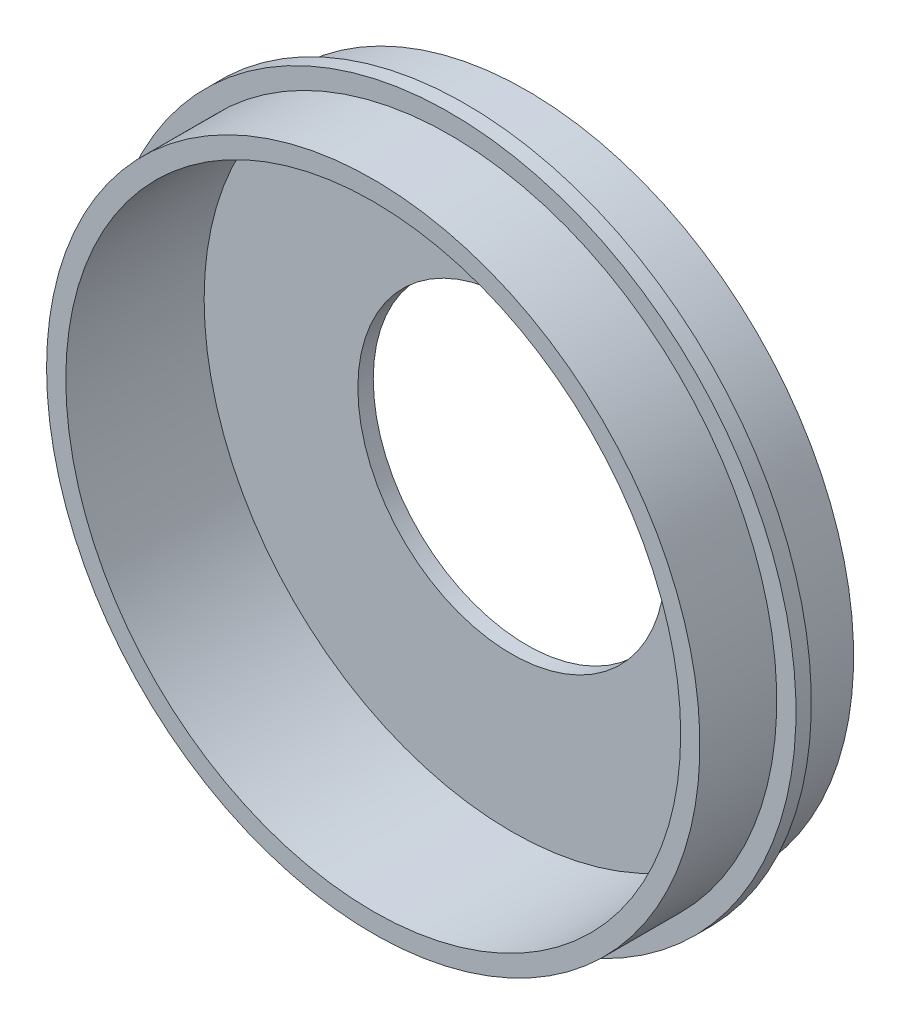
ISO-10303-21;
HEADER;
FILE_DESCRIPTION(('STEP AP214'),'2;1');
FILE_NAME('part.step','',(''),(''),'','','');
FILE_SCHEMA(('AUTOMOTIVE_DESIGN { 1 0 10303 214 1 1 1 1 }'));
ENDSEC;
DATA;
#1=APPLICATION_CONTEXT('core data for automotive mechanical design processes');
#2=APPLICATION_PROTOCOL_DEFINITION('international standard','automotive_design',2000,#1);
#3=PRODUCT_CONTEXT('',#1,'mechanical');
#4=PRODUCT('Part','Part','',(#3));
#5=PRODUCT_RELATED_PRODUCT_CATEGORY('part','',(#4));
#6=PRODUCT_DEFINITION_FORMATION('','',#4);
#7=PRODUCT_DEFINITION_CONTEXT('part definition',#1,'design');
#8=PRODUCT_DEFINITION('design','',#6,#7);
#9=PRODUCT_DEFINITION_SHAPE('','',#8);
#10=(LENGTH_UNIT() NAMED_UNIT(*) SI_UNIT(.MILLI.,.METRE.));
#11=(NAMED_UNIT(*) PLANE_ANGLE_UNIT() SI_UNIT($,.RADIAN.));
#12=(NAMED_UNIT(*) SI_UNIT($,.STERADIAN.) SOLID_ANGLE_UNIT());
#13=UNCERTAINTY_MEASURE_WITH_UNIT(LENGTH_MEASURE(1.E-05),#10,'distance_accuracy_value','');
#14=(GEOMETRIC_REPRESENTATION_CONTEXT(3) GLOBAL_UNCERTAINTY_ASSIGNED_CONTEXT((#13)) GLOBAL_UNIT_ASSIGNED_CONTEXT((#10,
#11,#12)) REPRESENTATION_CONTEXT('',''));
#15=CARTESIAN_POINT('',(0.,0.,0.));
#16=DIRECTION('',(0.,0.,1.));
#17=DIRECTION('',(1.,0.,0.));
#18=AXIS2_PLACEMENT_3D('',#15,#16,#17);
#19=CARTESIAN_POINT('',(0.,0.,0.));
#20=DIRECTION('',(0.,0.,-1.));
#21=DIRECTION('',(-1.,0.,0.));
#22=AXIS2_PLACEMENT_3D('',#19,#20,#21);
#23=CYLINDRICAL_SURFACE('',#22,53.975);
#24=CARTESIAN_POINT('',(0.,0.,25.4));
#25=DIRECTION('',(0.,0.,-1.));
#26=DIRECTION('',(-1.,0.,0.));
#27=AXIS2_PLACEMENT_3D('',#24,#25,#26);
#28=CIRCLE('',#27,53.975);
#29=CARTESIAN_POINT('',(-53.975,0.,25.4));
#30=VERTEX_POINT('',#29);
#31=EDGE_CURVE('E10',#30,#30,#28,.T.);
#32=ORIENTED_EDGE('',*,*,#31,.T.);
#33=EDGE_LOOP('',(#32));
#34=FACE_BOUND('',#33,.T.);
#35=CARTESIAN_POINT('',(0.,0.,12.7));
#36=DIRECTION('',(0.,0.,-1.));
#37=DIRECTION('',(-1.,0.,0.));
#38=AXIS2_PLACEMENT_3D('',#35,#36,#37);
#39=CIRCLE('',#38,53.975);
#40=CARTESIAN_POINT('',(-53.975,0.,12.7));
#41=VERTEX_POINT('',#40);
#42=EDGE_CURVE('E84',#41,#41,#39,.T.);
#43=ORIENTED_EDGE('',*,*,#42,.F.);
#44=EDGE_LOOP('',(#43));
#45=FACE_BOUND('',#44,.T.);
#46=ADVANCED_FACE('F41',(#34,#45),#23,.T.);
#47=CARTESIAN_POINT('',(0.,50.8,25.4));
#48=DIRECTION('',(0.,0.,1.));
#49=DIRECTION('',(1.,0.,0.));
#50=AXIS2_PLACEMENT_3D('',#47,#48,#49);
#51=PLANE('',#50);
#52=CARTESIAN_POINT('',(0.,0.,25.4));
#53=DIRECTION('',(0.,0.,-1.));
#54=DIRECTION('',(-1.,0.,0.));
#55=AXIS2_PLACEMENT_3D('',#52,#53,#54);
#56=CIRCLE('',#55,50.8);
#57=CARTESIAN_POINT('',(-50.8,0.,25.4));
#58=VERTEX_POINT('',#57);
#59=EDGE_CURVE('E48',#58,#58,#56,.T.);
#60=ORIENTED_EDGE('',*,*,#59,.T.);
#61=EDGE_LOOP('',(#60));
#62=FACE_BOUND('',#61,.T.);
#63=ORIENTED_EDGE('',*,*,#31,.F.);
#64=EDGE_LOOP('',(#63));
#65=FACE_BOUND('',#64,.T.);
#66=ADVANCED_FACE('F93',(#62,#65),#51,.T.);
#67=CARTESIAN_POINT('',(0.,0.,0.));
#68=DIRECTION('',(0.,0.,-1.));
#69=DIRECTION('',(-1.,0.,0.));
#70=AXIS2_PLACEMENT_3D('',#67,#68,#69);
#71=CYLINDRICAL_SURFACE('',#70,50.8);
#72=CARTESIAN_POINT('',(0.,0.,2.54));
#73=DIRECTION('',(0.,0.,-1.));
#74=DIRECTION('',(-1.,0.,0.));
#75=AXIS2_PLACEMENT_3D('',#72,#73,#74);
#76=CIRCLE('',#75,50.8);
#77=CARTESIAN_POINT('',(-50.8,0.,2.54));
#78=VERTEX_POINT('',#77);
#79=EDGE_CURVE('E53',#78,#78,#76,.T.);
#80=ORIENTED_EDGE('',*,*,#79,.T.);
#81=EDGE_LOOP('',(#80));
#82=FACE_BOUND('',#81,.T.);
#83=ORIENTED_EDGE('',*,*,#59,.F.);
#84=EDGE_LOOP('',(#83));
#85=FACE_BOUND('',#84,.T.);
#86=ADVANCED_FACE('F97',(#82,#85),#71,.F.);
#87=CARTESIAN_POINT('',(0.,25.4,2.54));
#88=DIRECTION('',(0.,0.,1.));
#89=DIRECTION('',(1.,0.,0.));
#90=AXIS2_PLACEMENT_3D('',#87,#88,#89);
#91=PLANE('',#90);
#92=CARTESIAN_POINT('',(0.,0.,2.54));
#93=DIRECTION('',(0.,0.,-1.));
#94=DIRECTION('',(-1.,0.,0.));
#95=AXIS2_PLACEMENT_3D('',#92,#93,#94);
#96=CIRCLE('',#95,25.4);
#97=CARTESIAN_POINT('',(-25.4,0.,2.54));
#98=VERTEX_POINT('',#97);
#99=EDGE_CURVE('E58',#98,#98,#96,.T.);
#100=ORIENTED_EDGE('',*,*,#99,.T.);
#101=EDGE_LOOP('',(#100));
#102=FACE_BOUND('',#101,.T.);
#103=ORIENTED_EDGE('',*,*,#79,.F.);
#104=EDGE_LOOP('',(#103));
#105=FACE_BOUND('',#104,.T.);
#106=ADVANCED_FACE('F101',(#102,#105),#91,.T.);
#107=CARTESIAN_POINT('',(0.,0.,0.));
#108=DIRECTION('',(0.,0.,-1.));
#109=DIRECTION('',(-1.,0.,0.));
#110=AXIS2_PLACEMENT_3D('',#107,#108,#109);
#111=CYLINDRICAL_SURFACE('',#110,25.4);
#112=CARTESIAN_POINT('',(0.,0.,0.));
#113=DIRECTION('',(0.,0.,-1.));
#114=DIRECTION('',(-1.,0.,0.));
#115=AXIS2_PLACEMENT_3D('',#112,#113,#114);
#116=CIRCLE('',#115,25.4);
#117=CARTESIAN_POINT('',(-25.4,0.,0.));
#118=VERTEX_POINT('',#117);
#119=EDGE_CURVE('E64',#118,#118,#116,.T.);
#120=ORIENTED_EDGE('',*,*,#119,.T.);
#121=EDGE_LOOP('',(#120));
#122=FACE_BOUND('',#121,.T.);
#123=ORIENTED_EDGE('',*,*,#99,.F.);
#124=EDGE_LOOP('',(#123));
#125=FACE_BOUND('',#124,.T.);
#126=ADVANCED_FACE('F108',(#122,#125),#111,.F.);
#127=CARTESIAN_POINT('',(0.,53.975,0.));
#128=DIRECTION('',(0.,0.,-1.));
#129=DIRECTION('',(-1.,0.,0.));
#130=AXIS2_PLACEMENT_3D('',#127,#128,#129);
#131=PLANE('',#130);
#132=CARTESIAN_POINT('',(0.,0.,0.));
#133=DIRECTION('',(0.,0.,-1.));
#134=DIRECTION('',(-1.,0.,0.));
#135=AXIS2_PLACEMENT_3D('',#132,#133,#134);
#136=CIRCLE('',#135,53.975);
#137=CARTESIAN_POINT('',(-53.975,0.,0.));
#138=VERTEX_POINT('',#137);
#139=EDGE_CURVE('E68',#138,#138,#136,.T.);
#140=ORIENTED_EDGE('',*,*,#139,.T.);
#141=EDGE_LOOP('',(#140));
#142=FACE_BOUND('',#141,.T.);
#143=ORIENTED_EDGE('',*,*,#119,.F.);
#144=EDGE_LOOP('',(#143));
#145=FACE_BOUND('',#144,.T.);
#146=ADVANCED_FACE('F112',(#142,#145),#131,.T.);
#147=CARTESIAN_POINT('',(0.,0.,0.));
#148=DIRECTION('',(0.,0.,-1.));
#149=DIRECTION('',(-1.,0.,0.));
#150=AXIS2_PLACEMENT_3D('',#147,#148,#149);
#151=CYLINDRICAL_SURFACE('',#150,53.975);
#152=CARTESIAN_POINT('',(0.,0.,10.16));
#153=DIRECTION('',(0.,0.,-1.));
#154=DIRECTION('',(-1.,0.,0.));
#155=AXIS2_PLACEMENT_3D('',#152,#153,#154);
#156=CIRCLE('',#155,53.975);
#157=CARTESIAN_POINT('',(-53.975,0.,10.16));
#158=VERTEX_POINT('',#157);
#159=EDGE_CURVE('E72',#158,#158,#156,.T.);
#160=ORIENTED_EDGE('',*,*,#159,.T.);
#161=EDGE_LOOP('',(#160));
#162=FACE_BOUND('',#161,.T.);
#163=ORIENTED_EDGE('',*,*,#139,.F.);
#164=EDGE_LOOP('',(#163));
#165=FACE_BOUND('',#164,.T.);
#166=ADVANCED_FACE('F116',(#162,#165),#151,.T.);
#167=CARTESIAN_POINT('',(0.,57.15,10.16));
#168=DIRECTION('',(0.,0.,-1.));
#169=DIRECTION('',(-1.,0.,0.));
#170=AXIS2_PLACEMENT_3D('',#167,#168,#169);
#171=PLANE('',#170);
#172=CARTESIAN_POINT('',(0.,0.,10.16));
#173=DIRECTION('',(0.,0.,-1.));
#174=DIRECTION('',(-1.,0.,0.));
#175=AXIS2_PLACEMENT_3D('',#172,#173,#174);
#176=CIRCLE('',#175,57.15);
#177=CARTESIAN_POINT('',(-57.15,0.,10.16));
#178=VERTEX_POINT('',#177);
#179=EDGE_CURVE('E76',#178,#178,#176,.T.);
#180=ORIENTED_EDGE('',*,*,#179,.T.);
#181=EDGE_LOOP('',(#180));
#182=FACE_BOUND('',#181,.T.);
#183=ORIENTED_EDGE('',*,*,#159,.F.);
#184=EDGE_LOOP('',(#183));
#185=FACE_BOUND('',#184,.T.);
#186=ADVANCED_FACE('F120',(#182,#185),#171,.T.);
#187=CARTESIAN_POINT('',(0.,0.,0.));
#188=DIRECTION('',(0.,0.,-1.));
#189=DIRECTION('',(-1.,0.,0.));
#190=AXIS2_PLACEMENT_3D('',#187,#188,#189);
#191=CYLINDRICAL_SURFACE('',#190,57.15);
#192=CARTESIAN_POINT('',(0.,0.,12.7));
#193=DIRECTION('',(0.,0.,-1.));
#194=DIRECTION('',(-1.,0.,0.));
#195=AXIS2_PLACEMENT_3D('',#192,#193,#194);
#196=CIRCLE('',#195,57.15);
#197=CARTESIAN_POINT('',(-57.15,0.,12.7));
#198=VERTEX_POINT('',#197);
#199=EDGE_CURVE('E80',#198,#198,#196,.T.);
#200=ORIENTED_EDGE('',*,*,#199,.T.);
#201=EDGE_LOOP('',(#200));
#202=FACE_BOUND('',#201,.T.);
#203=ORIENTED_EDGE('',*,*,#179,.F.);
#204=EDGE_LOOP('',(#203));
#205=FACE_BOUND('',#204,.T.);
#206=ADVANCED_FACE('F124',(#202,#205),#191,.T.);
#207=CARTESIAN_POINT('',(0.,53.975,12.7));
#208=DIRECTION('',(0.,0.,1.));
#209=DIRECTION('',(1.,0.,0.));
#210=AXIS2_PLACEMENT_3D('',#207,#208,#209);
#211=PLANE('',#210);
#212=ORIENTED_EDGE('',*,*,#42,.T.);
#213=EDGE_LOOP('',(#212));
#214=FACE_BOUND('',#213,.T.);
#215=ORIENTED_EDGE('',*,*,#199,.F.);
#216=EDGE_LOOP('',(#215));
#217=FACE_BOUND('',#216,.T.);
#218=ADVANCED_FACE('F89',(#214,#217),#211,.T.);
#219=CLOSED_SHELL('',(#46,#66,#86,#106,#126,#146,#166,#186,#206,#218));
#220=MANIFOLD_SOLID_BREP('B2',#219);
#221=ADVANCED_BREP_SHAPE_REPRESENTATION('',(#18,#220),#14);
#222=SHAPE_DEFINITION_REPRESENTATION(#9,#221);
ENDSEC;
END-ISO-10303-21;
